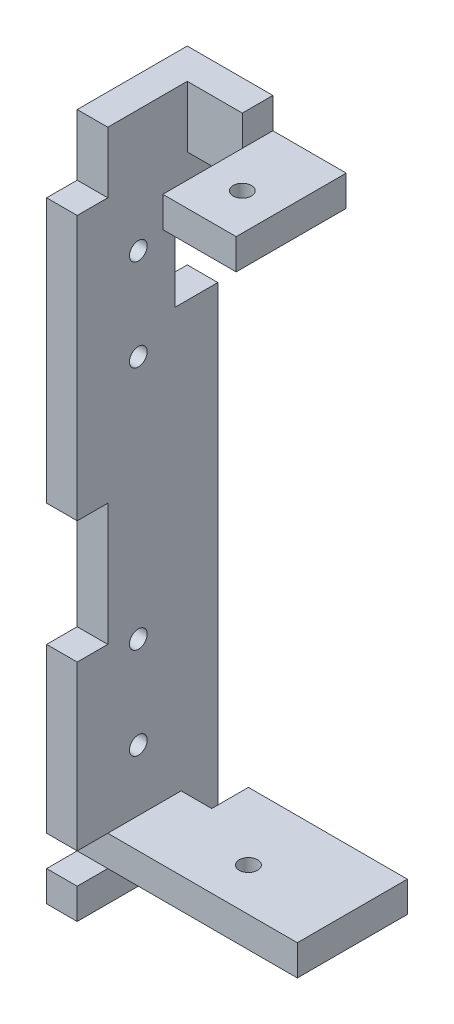
ISO-10303-21;
HEADER;
FILE_DESCRIPTION(('STEP AP214'),'2;1');
FILE_NAME('part.step','',(''),(''),'','','');
FILE_SCHEMA(('AUTOMOTIVE_DESIGN { 1 0 10303 214 1 1 1 1 }'));
ENDSEC;
DATA;
#1=APPLICATION_CONTEXT('core data for automotive mechanical design processes');
#2=APPLICATION_PROTOCOL_DEFINITION('international standard','automotive_design',2000,#1);
#3=PRODUCT_CONTEXT('',#1,'mechanical');
#4=PRODUCT('Part','Part','',(#3));
#5=PRODUCT_RELATED_PRODUCT_CATEGORY('part','',(#4));
#6=PRODUCT_DEFINITION_FORMATION('','',#4);
#7=PRODUCT_DEFINITION_CONTEXT('part definition',#1,'design');
#8=PRODUCT_DEFINITION('design','',#6,#7);
#9=PRODUCT_DEFINITION_SHAPE('','',#8);
#10=(LENGTH_UNIT() NAMED_UNIT(*) SI_UNIT(.MILLI.,.METRE.));
#11=(NAMED_UNIT(*) PLANE_ANGLE_UNIT() SI_UNIT($,.RADIAN.));
#12=(NAMED_UNIT(*) SI_UNIT($,.STERADIAN.) SOLID_ANGLE_UNIT());
#13=UNCERTAINTY_MEASURE_WITH_UNIT(LENGTH_MEASURE(1.E-05),#10,'distance_accuracy_value','');
#14=(GEOMETRIC_REPRESENTATION_CONTEXT(3) GLOBAL_UNCERTAINTY_ASSIGNED_CONTEXT((#13)) GLOBAL_UNIT_ASSIGNED_CONTEXT((#10,
#11,#12)) REPRESENTATION_CONTEXT('',''));
#15=CARTESIAN_POINT('',(0.,0.,0.));
#16=DIRECTION('',(0.,0.,1.));
#17=DIRECTION('',(1.,0.,0.));
#18=AXIS2_PLACEMENT_3D('',#15,#16,#17);
#19=CARTESIAN_POINT('',(0.,0.,18.));
#20=DIRECTION('',(0.,0.,-1.));
#21=DIRECTION('',(-1.,0.,0.));
#22=AXIS2_PLACEMENT_3D('',#19,#20,#21);
#23=PLANE('',#22);
#24=DIRECTION('',(-1.,0.,0.));
#25=VECTOR('',#24,1.);
#26=CARTESIAN_POINT('',(14.3930651789069,91.6076542783441,18.));
#27=LINE('',#26,#25);
#28=CARTESIAN_POINT('',(14.3930651789069,91.6076542783441,18.));
#29=VERTEX_POINT('',#28);
#30=CARTESIAN_POINT('',(2.39306517890692,91.6076542783441,18.));
#31=VERTEX_POINT('',#30);
#32=EDGE_CURVE('E303',#29,#31,#27,.T.);
#33=ORIENTED_EDGE('',*,*,#32,.T.);
#34=DIRECTION('',(0.,1.,0.));
#35=VECTOR('',#34,1.);
#36=CARTESIAN_POINT('',(2.39306517890692,96.6076542783441,18.));
#37=LINE('',#36,#35);
#38=CARTESIAN_POINT('',(2.39306517890692,86.607654278344,18.));
#39=VERTEX_POINT('',#38);
#40=EDGE_CURVE('E252',#39,#31,#37,.T.);
#41=ORIENTED_EDGE('',*,*,#40,.F.);
#42=DIRECTION('',(1.,0.,0.));
#43=VECTOR('',#42,1.);
#44=CARTESIAN_POINT('',(14.3930651789069,86.607654278344,18.));
#45=LINE('',#44,#43);
#46=CARTESIAN_POINT('',(14.3930651789069,86.607654278344,18.));
#47=VERTEX_POINT('',#46);
#48=EDGE_CURVE('E306',#39,#47,#45,.T.);
#49=ORIENTED_EDGE('',*,*,#48,.T.);
#50=DIRECTION('',(0.,1.,0.));
#51=VECTOR('',#50,1.);
#52=CARTESIAN_POINT('',(14.3930651789069,91.6076542783441,18.));
#53=LINE('',#52,#51);
#54=EDGE_CURVE('E301',#47,#29,#53,.T.);
#55=ORIENTED_EDGE('',*,*,#54,.T.);
#56=EDGE_LOOP('',(#33,#41,#49,#55));
#57=FACE_BOUND('',#56,.T.);
#58=ADVANCED_FACE('F32',(#57),#23,.F.);
#59=CARTESIAN_POINT('',(0.,0.,0.));
#60=DIRECTION('',(0.,0.,1.));
#61=DIRECTION('',(1.,0.,0.));
#62=AXIS2_PLACEMENT_3D('',#59,#60,#61);
#63=PLANE('',#62);
#64=DIRECTION('',(0.,1.,0.));
#65=VECTOR('',#64,1.);
#66=CARTESIAN_POINT('',(-6.60693482109309,91.6076542783441,0.));
#67=LINE('',#66,#65);
#68=CARTESIAN_POINT('',(-6.60693482109309,-13.3923457216559,0.));
#69=VERTEX_POINT('',#68);
#70=CARTESIAN_POINT('',(-6.60693482109309,65.6076542783441,0.));
#71=VERTEX_POINT('',#70);
#72=EDGE_CURVE('E424',#69,#71,#67,.T.);
#73=ORIENTED_EDGE('',*,*,#72,.F.);
#74=DIRECTION('',(1.,0.,0.));
#75=VECTOR('',#74,1.);
#76=CARTESIAN_POINT('',(-11.6069348210931,-13.3923457216559,0.));
#77=LINE('',#76,#75);
#78=CARTESIAN_POINT('',(-11.6069348210931,-13.3923457216559,0.));
#79=VERTEX_POINT('',#78);
#80=EDGE_CURVE('E412',#79,#69,#77,.T.);
#81=ORIENTED_EDGE('',*,*,#80,.F.);
#82=DIRECTION('',(0.,-1.,0.));
#83=VECTOR('',#82,1.);
#84=CARTESIAN_POINT('',(-11.6069348210931,91.6076542783441,0.));
#85=LINE('',#84,#83);
#86=CARTESIAN_POINT('',(-11.6069348210931,65.6076542783441,0.));
#87=VERTEX_POINT('',#86);
#88=EDGE_CURVE('E396',#87,#79,#85,.T.);
#89=ORIENTED_EDGE('',*,*,#88,.F.);
#90=DIRECTION('',(-1.,0.,0.));
#91=VECTOR('',#90,1.);
#92=CARTESIAN_POINT('',(24.3940651789069,65.6076542783441,0.));
#93=LINE('',#92,#91);
#94=EDGE_CURVE('E289',#71,#87,#93,.T.);
#95=ORIENTED_EDGE('',*,*,#94,.F.);
#96=EDGE_LOOP('',(#73,#81,#89,#95));
#97=FACE_BOUND('',#96,.T.);
#98=ADVANCED_FACE('F450',(#97),#63,.F.);
#99=CARTESIAN_POINT('',(-11.6069348210931,91.6076542783441,23.));
#100=DIRECTION('',(0.,-1.,0.));
#101=DIRECTION('',(0.,0.,-1.));
#102=AXIS2_PLACEMENT_3D('',#99,#100,#101);
#103=PLANE('',#102);
#104=CARTESIAN_POINT('',(8.39306517890691,91.6076542783441,11.));
#105=DIRECTION('',(0.,1.,0.));
#106=DIRECTION('',(0.,0.,1.));
#107=AXIS2_PLACEMENT_3D('',#104,#105,#106);
#108=CIRCLE('',#107,1.5);
#109=CARTESIAN_POINT('',(8.39306517890691,91.6076542783441,12.5));
#110=VERTEX_POINT('',#109);
#111=EDGE_CURVE('E482',#110,#110,#108,.T.);
#112=ORIENTED_EDGE('',*,*,#111,.F.);
#113=EDGE_LOOP('',(#112));
#114=FACE_BOUND('',#113,.T.);
#115=DIRECTION('',(0.,0.,-1.));
#116=VECTOR('',#115,1.);
#117=CARTESIAN_POINT('',(2.39306517890692,91.6076542783441,14.));
#118=LINE('',#117,#116);
#119=CARTESIAN_POINT('',(2.39306517890692,91.6076542783441,5.));
#120=VERTEX_POINT('',#119);
#121=EDGE_CURVE('E242',#31,#120,#118,.T.);
#122=ORIENTED_EDGE('',*,*,#121,.F.);
#123=ORIENTED_EDGE('',*,*,#32,.F.);
#124=DIRECTION('',(0.,0.,-1.));
#125=VECTOR('',#124,1.);
#126=CARTESIAN_POINT('',(14.3930651789069,91.6076542783441,49.4764045897475));
#127=LINE('',#126,#125);
#128=CARTESIAN_POINT('',(14.3930651789069,91.6076542783441,0.));
#129=VERTEX_POINT('',#128);
#130=EDGE_CURVE('E341',#29,#129,#127,.T.);
#131=ORIENTED_EDGE('',*,*,#130,.T.);
#132=DIRECTION('',(1.,0.,0.));
#133=VECTOR('',#132,1.);
#134=CARTESIAN_POINT('',(14.3930651789069,91.6076542783441,0.));
#135=LINE('',#134,#133);
#136=CARTESIAN_POINT('',(2.39306517890692,91.6076542783441,0.));
#137=VERTEX_POINT('',#136);
#138=EDGE_CURVE('E268',#137,#129,#135,.T.);
#139=ORIENTED_EDGE('',*,*,#138,.F.);
#140=DIRECTION('',(0.,0.,1.));
#141=VECTOR('',#140,1.);
#142=CARTESIAN_POINT('',(2.39306517890692,91.6076542783441,0.));
#143=LINE('',#142,#141);
#144=EDGE_CURVE('E271',#137,#120,#143,.T.);
#145=ORIENTED_EDGE('',*,*,#144,.T.);
#146=EDGE_LOOP('',(#122,#123,#131,#139,#145));
#147=FACE_BOUND('',#146,.T.);
#148=ADVANCED_FACE('F541',(#114,#147),#103,.F.);
#149=CARTESIAN_POINT('',(-6.60693482109309,78.6076542783441,0.));
#150=VERTEX_POINT('',#149);
#151=CARTESIAN_POINT('',(-6.60693482109309,86.607654278344,0.));
#152=VERTEX_POINT('',#151);
#153=EDGE_CURVE('E423',#150,#152,#67,.T.);
#154=ORIENTED_EDGE('',*,*,#153,.F.);
#155=DIRECTION('',(-1.,0.,0.));
#156=VECTOR('',#155,1.);
#157=CARTESIAN_POINT('',(24.3940651789069,78.6076542783441,0.));
#158=LINE('',#157,#156);
#159=CARTESIAN_POINT('',(-11.6069348210931,78.6076542783441,0.));
#160=VERTEX_POINT('',#159);
#161=EDGE_CURVE('E290',#150,#160,#158,.T.);
#162=ORIENTED_EDGE('',*,*,#161,.T.);
#163=CARTESIAN_POINT('',(-11.6069348210931,96.6076542783441,0.));
#164=VERTEX_POINT('',#163);
#165=EDGE_CURVE('E331',#164,#160,#85,.T.);
#166=ORIENTED_EDGE('',*,*,#165,.F.);
#167=DIRECTION('',(-1.,0.,0.));
#168=VECTOR('',#167,1.);
#169=CARTESIAN_POINT('',(-11.6069348210931,96.6076542783441,0.));
#170=LINE('',#169,#168);
#171=CARTESIAN_POINT('',(2.39306517890692,96.6076542783441,0.));
#172=VERTEX_POINT('',#171);
#173=EDGE_CURVE('E241',#172,#164,#170,.T.);
#174=ORIENTED_EDGE('',*,*,#173,.F.);
#175=DIRECTION('',(0.,-1.,0.));
#176=VECTOR('',#175,1.);
#177=CARTESIAN_POINT('',(2.39306517890692,86.607654278344,0.));
#178=LINE('',#177,#176);
#179=EDGE_CURVE('E251',#172,#137,#178,.T.);
#180=ORIENTED_EDGE('',*,*,#179,.T.);
#181=ORIENTED_EDGE('',*,*,#138,.T.);
#182=DIRECTION('',(0.,-1.,0.));
#183=VECTOR('',#182,1.);
#184=CARTESIAN_POINT('',(14.3930651789069,91.6076542783441,0.));
#185=LINE('',#184,#183);
#186=CARTESIAN_POINT('',(14.3930651789069,86.607654278344,0.));
#187=VERTEX_POINT('',#186);
#188=EDGE_CURVE('E259',#129,#187,#185,.T.);
#189=ORIENTED_EDGE('',*,*,#188,.T.);
#190=DIRECTION('',(-1.,0.,0.));
#191=VECTOR('',#190,1.);
#192=CARTESIAN_POINT('',(14.3930651789069,86.607654278344,0.));
#193=LINE('',#192,#191);
#194=EDGE_CURVE('E262',#187,#152,#193,.T.);
#195=ORIENTED_EDGE('',*,*,#194,.T.);
#196=EDGE_LOOP('',(#154,#162,#166,#174,#180,#181,#189,#195));
#197=FACE_BOUND('',#196,.T.);
#198=ADVANCED_FACE('F463',(#197),#63,.F.);
#199=CARTESIAN_POINT('',(0.,0.,23.));
#200=DIRECTION('',(0.,0.,1.));
#201=DIRECTION('',(1.,0.,0.));
#202=AXIS2_PLACEMENT_3D('',#199,#200,#201);
#203=PLANE('',#202);
#204=DIRECTION('',(1.,0.,0.));
#205=VECTOR('',#204,1.);
#206=CARTESIAN_POINT('',(24.3930651789069,-8.39234572165595,23.));
#207=LINE('',#206,#205);
#208=CARTESIAN_POINT('',(-11.6069348210931,-8.39234572165596,23.));
#209=VERTEX_POINT('',#208);
#210=CARTESIAN_POINT('',(-6.60693482109309,-8.39234572165596,23.));
#211=VERTEX_POINT('',#210);
#212=EDGE_CURVE('E349',#209,#211,#207,.T.);
#213=ORIENTED_EDGE('',*,*,#212,.F.);
#214=DIRECTION('',(0.,-1.,0.));
#215=VECTOR('',#214,1.);
#216=CARTESIAN_POINT('',(-11.6069348210931,91.6076542783441,23.));
#217=LINE('',#216,#215);
#218=CARTESIAN_POINT('',(-11.6069348210931,-13.3923457216559,23.));
#219=VERTEX_POINT('',#218);
#220=EDGE_CURVE('E401',#209,#219,#217,.T.);
#221=ORIENTED_EDGE('',*,*,#220,.T.);
#222=DIRECTION('',(1.,0.,0.));
#223=VECTOR('',#222,1.);
#224=CARTESIAN_POINT('',(-11.6069348210931,-13.3923457216559,23.));
#225=LINE('',#224,#223);
#226=CARTESIAN_POINT('',(-6.60693482109309,-13.3923457216559,23.));
#227=VERTEX_POINT('',#226);
#228=EDGE_CURVE('E399',#219,#227,#225,.T.);
#229=ORIENTED_EDGE('',*,*,#228,.T.);
#230=DIRECTION('',(0.,1.,0.));
#231=VECTOR('',#230,1.);
#232=CARTESIAN_POINT('',(-6.60693482109309,-8.39234572165595,23.));
#233=LINE('',#232,#231);
#234=EDGE_CURVE('E403',#227,#211,#233,.T.);
#235=ORIENTED_EDGE('',*,*,#234,.T.);
#236=EDGE_LOOP('',(#213,#221,#229,#235));
#237=FACE_BOUND('',#236,.T.);
#238=ADVANCED_FACE('F595',(#237),#203,.T.);
#239=CARTESIAN_POINT('',(-11.6069348210931,91.6076542783441,23.));
#240=DIRECTION('',(1.,0.,0.));
#241=DIRECTION('',(0.,1.,0.));
#242=AXIS2_PLACEMENT_3D('',#239,#240,#241);
#243=PLANE('',#242);
#244=CARTESIAN_POINT('',(-11.6069348210931,21.6076542783441,13.));
#245=DIRECTION('',(-1.,0.,0.));
#246=DIRECTION('',(0.,-1.,0.));
#247=AXIS2_PLACEMENT_3D('',#244,#245,#246);
#248=CIRCLE('',#247,1.45);
#249=CARTESIAN_POINT('',(-11.6069348210931,20.1576542783441,13.));
#250=VERTEX_POINT('',#249);
#251=EDGE_CURVE('E503',#250,#250,#248,.T.);
#252=ORIENTED_EDGE('',*,*,#251,.F.);
#253=EDGE_LOOP('',(#252));
#254=FACE_BOUND('',#253,.T.);
#255=CARTESIAN_POINT('',(-11.6069348210931,61.6076542783441,13.));
#256=DIRECTION('',(-1.,0.,0.));
#257=DIRECTION('',(0.,-1.,0.));
#258=AXIS2_PLACEMENT_3D('',#255,#256,#257);
#259=CIRCLE('',#258,1.45);
#260=CARTESIAN_POINT('',(-11.6069348210931,60.1576542783441,13.));
#261=VERTEX_POINT('',#260);
#262=EDGE_CURVE('E510',#261,#261,#259,.T.);
#263=ORIENTED_EDGE('',*,*,#262,.F.);
#264=EDGE_LOOP('',(#263));
#265=FACE_BOUND('',#264,.T.);
#266=CARTESIAN_POINT('',(-11.6069348210931,6.60765427834406,13.));
#267=DIRECTION('',(-1.,0.,0.));
#268=DIRECTION('',(0.,-1.,0.));
#269=AXIS2_PLACEMENT_3D('',#266,#267,#268);
#270=CIRCLE('',#269,1.45);
#271=CARTESIAN_POINT('',(-11.6069348210931,5.15765427834406,13.));
#272=VERTEX_POINT('',#271);
#273=EDGE_CURVE('E516',#272,#272,#270,.T.);
#274=ORIENTED_EDGE('',*,*,#273,.F.);
#275=EDGE_LOOP('',(#274));
#276=FACE_BOUND('',#275,.T.);
#277=CARTESIAN_POINT('',(-11.6069348210931,76.6076542783441,13.));
#278=DIRECTION('',(-1.,0.,0.));
#279=DIRECTION('',(0.,-1.,0.));
#280=AXIS2_PLACEMENT_3D('',#277,#278,#279);
#281=CIRCLE('',#280,1.45);
#282=CARTESIAN_POINT('',(-11.6069348210931,75.157654278344,13.));
#283=VERTEX_POINT('',#282);
#284=EDGE_CURVE('E316',#283,#283,#281,.T.);
#285=ORIENTED_EDGE('',*,*,#284,.F.);
#286=EDGE_LOOP('',(#285));
#287=FACE_BOUND('',#286,.T.);
#288=ORIENTED_EDGE('',*,*,#165,.T.);
#289=DIRECTION('',(0.,0.,-1.));
#290=VECTOR('',#289,1.);
#291=CARTESIAN_POINT('',(-11.6069348210931,78.6076542783441,0.));
#292=LINE('',#291,#290);
#293=CARTESIAN_POINT('',(-11.6069348210931,78.6076542783441,7.));
#294=VERTEX_POINT('',#293);
#295=EDGE_CURVE('E287',#294,#160,#292,.T.);
#296=ORIENTED_EDGE('',*,*,#295,.F.);
#297=DIRECTION('',(0.,1.,0.));
#298=VECTOR('',#297,1.);
#299=CARTESIAN_POINT('',(-11.6069348210931,78.6076542783441,7.));
#300=LINE('',#299,#298);
#301=CARTESIAN_POINT('',(-11.6069348210931,65.6076542783441,7.));
#302=VERTEX_POINT('',#301);
#303=EDGE_CURVE('E284',#302,#294,#300,.T.);
#304=ORIENTED_EDGE('',*,*,#303,.F.);
#305=DIRECTION('',(0.,0.,1.));
#306=VECTOR('',#305,1.);
#307=CARTESIAN_POINT('',(-11.6069348210931,65.6076542783441,0.));
#308=LINE('',#307,#306);
#309=EDGE_CURVE('E281',#87,#302,#308,.T.);
#310=ORIENTED_EDGE('',*,*,#309,.F.);
#311=ORIENTED_EDGE('',*,*,#88,.T.);
#312=DIRECTION('',(0.,0.,-1.));
#313=VECTOR('',#312,1.);
#314=CARTESIAN_POINT('',(-11.6069348210931,-13.3923457216559,23.));
#315=LINE('',#314,#313);
#316=EDGE_CURVE('E11',#219,#79,#315,.T.);
#317=ORIENTED_EDGE('',*,*,#316,.F.);
#318=ORIENTED_EDGE('',*,*,#220,.F.);
#319=DIRECTION('',(0.,0.,-1.));
#320=VECTOR('',#319,1.);
#321=CARTESIAN_POINT('',(-11.6069348210931,-8.39234572165595,23.));
#322=LINE('',#321,#320);
#323=CARTESIAN_POINT('',(-11.6069348210931,-8.39234572165596,18.));
#324=VERTEX_POINT('',#323);
#325=EDGE_CURVE('E364',#209,#324,#322,.T.);
#326=ORIENTED_EDGE('',*,*,#325,.T.);
#327=DIRECTION('',(0.,1.,0.));
#328=VECTOR('',#327,1.);
#329=CARTESIAN_POINT('',(-11.6069348210931,91.6076542783441,18.));
#330=LINE('',#329,#328);
#331=CARTESIAN_POINT('',(-11.6069348210931,-3.39234572165596,18.));
#332=VERTEX_POINT('',#331);
#333=EDGE_CURVE('E358',#324,#332,#330,.T.);
#334=ORIENTED_EDGE('',*,*,#333,.T.);
#335=DIRECTION('',(0.,0.,1.));
#336=VECTOR('',#335,1.);
#337=CARTESIAN_POINT('',(-11.6069348210931,-3.39234572165595,23.));
#338=LINE('',#337,#336);
#339=CARTESIAN_POINT('',(-11.6069348210931,-3.39234572165596,23.));
#340=VERTEX_POINT('',#339);
#341=EDGE_CURVE('E361',#332,#340,#338,.T.);
#342=ORIENTED_EDGE('',*,*,#341,.T.);
#343=CARTESIAN_POINT('',(-11.6069348210931,23.3576542783441,23.));
#344=VERTEX_POINT('',#343);
#345=EDGE_CURVE('E400',#344,#340,#217,.T.);
#346=ORIENTED_EDGE('',*,*,#345,.F.);
#347=DIRECTION('',(0.,0.,1.));
#348=VECTOR('',#347,1.);
#349=CARTESIAN_POINT('',(-11.6069348210931,23.3576542783441,18.));
#350=LINE('',#349,#348);
#351=CARTESIAN_POINT('',(-11.6069348210931,23.3576542783441,18.));
#352=VERTEX_POINT('',#351);
#353=EDGE_CURVE('E391',#352,#344,#350,.T.);
#354=ORIENTED_EDGE('',*,*,#353,.F.);
#355=DIRECTION('',(0.,1.,0.));
#356=VECTOR('',#355,1.);
#357=CARTESIAN_POINT('',(-11.6069348210931,23.3576542783441,18.));
#358=LINE('',#357,#356);
#359=CARTESIAN_POINT('',(-11.6069348210931,43.3576542783441,18.));
#360=VERTEX_POINT('',#359);
#361=EDGE_CURVE('E376',#352,#360,#358,.T.);
#362=ORIENTED_EDGE('',*,*,#361,.T.);
#363=DIRECTION('',(0.,0.,1.));
#364=VECTOR('',#363,1.);
#365=CARTESIAN_POINT('',(-11.6069348210931,43.3576542783441,18.));
#366=LINE('',#365,#364);
#367=CARTESIAN_POINT('',(-11.6069348210931,43.3576542783441,23.));
#368=VERTEX_POINT('',#367);
#369=EDGE_CURVE('E388',#360,#368,#366,.T.);
#370=ORIENTED_EDGE('',*,*,#369,.T.);
#371=CARTESIAN_POINT('',(-11.6069348210931,86.607654278344,23.));
#372=VERTEX_POINT('',#371);
#373=EDGE_CURVE('E397',#372,#368,#217,.T.);
#374=ORIENTED_EDGE('',*,*,#373,.F.);
#375=DIRECTION('',(0.,0.,-1.));
#376=VECTOR('',#375,1.);
#377=CARTESIAN_POINT('',(-11.6069348210931,86.607654278344,23.));
#378=LINE('',#377,#376);
#379=CARTESIAN_POINT('',(-11.6069348210931,86.607654278344,18.));
#380=VERTEX_POINT('',#379);
#381=EDGE_CURVE('E335',#372,#380,#378,.T.);
#382=ORIENTED_EDGE('',*,*,#381,.T.);
#383=DIRECTION('',(0.,1.,0.));
#384=VECTOR('',#383,1.);
#385=CARTESIAN_POINT('',(-11.6069348210931,91.6076542783441,18.));
#386=LINE('',#385,#384);
#387=CARTESIAN_POINT('',(-11.6069348210931,96.6076542783441,18.));
#388=VERTEX_POINT('',#387);
#389=EDGE_CURVE('E333',#380,#388,#386,.T.);
#390=ORIENTED_EDGE('',*,*,#389,.T.);
#391=DIRECTION('',(0.,0.,1.));
#392=VECTOR('',#391,1.);
#393=CARTESIAN_POINT('',(-11.6069348210931,96.6076542783441,5.));
#394=LINE('',#393,#392);
#395=EDGE_CURVE('E258',#164,#388,#394,.T.);
#396=ORIENTED_EDGE('',*,*,#395,.F.);
#397=EDGE_LOOP('',(#288,#296,#304,#310,#311,#317,#318,#326,#334,#342,#346,#354,#362,#370,#374,
#382,#390,#396));
#398=FACE_BOUND('',#397,.T.);
#399=ADVANCED_FACE('F34',(#254,#265,#276,#287,#398),#243,.F.);
#400=DIRECTION('',(-1.,0.,0.));
#401=VECTOR('',#400,1.);
#402=CARTESIAN_POINT('',(24.3930651789069,-3.39234572165595,23.));
#403=LINE('',#402,#401);
#404=CARTESIAN_POINT('',(-6.60693482109308,-3.39234572165596,23.));
#405=VERTEX_POINT('',#404);
#406=EDGE_CURVE('E344',#405,#340,#403,.T.);
#407=ORIENTED_EDGE('',*,*,#406,.F.);
#408=DIRECTION('',(0.,1.,0.));
#409=VECTOR('',#408,1.);
#410=CARTESIAN_POINT('',(-6.60693482109309,81.2169362732362,23.));
#411=LINE('',#410,#409);
#412=CARTESIAN_POINT('',(-6.60693482109308,23.3576542783441,23.));
#413=VERTEX_POINT('',#412);
#414=EDGE_CURVE('E407',#405,#413,#411,.T.);
#415=ORIENTED_EDGE('',*,*,#414,.T.);
#416=DIRECTION('',(-1.,0.,0.));
#417=VECTOR('',#416,1.);
#418=CARTESIAN_POINT('',(-6.60693482109308,23.3576542783441,23.));
#419=LINE('',#418,#417);
#420=EDGE_CURVE('E382',#413,#344,#419,.T.);
#421=ORIENTED_EDGE('',*,*,#420,.T.);
#422=ORIENTED_EDGE('',*,*,#345,.T.);
#423=EDGE_LOOP('',(#407,#415,#421,#422));
#424=FACE_BOUND('',#423,.T.);
#425=ADVANCED_FACE('F592',(#424),#203,.T.);
#426=DIRECTION('',(1.,0.,0.));
#427=VECTOR('',#426,1.);
#428=CARTESIAN_POINT('',(14.3930651789069,86.607654278344,23.));
#429=LINE('',#428,#427);
#430=CARTESIAN_POINT('',(-6.60693482109309,86.607654278344,23.));
#431=VERTEX_POINT('',#430);
#432=EDGE_CURVE('E300',#372,#431,#429,.T.);
#433=ORIENTED_EDGE('',*,*,#432,.F.);
#434=ORIENTED_EDGE('',*,*,#373,.T.);
#435=DIRECTION('',(1.,0.,0.));
#436=VECTOR('',#435,1.);
#437=CARTESIAN_POINT('',(-6.60693482109308,43.3576542783441,23.));
#438=LINE('',#437,#436);
#439=CARTESIAN_POINT('',(-6.60693482109309,43.3576542783441,23.));
#440=VERTEX_POINT('',#439);
#441=EDGE_CURVE('E374',#368,#440,#438,.T.);
#442=ORIENTED_EDGE('',*,*,#441,.T.);
#443=EDGE_CURVE('E406',#440,#431,#411,.T.);
#444=ORIENTED_EDGE('',*,*,#443,.T.);
#445=EDGE_LOOP('',(#433,#434,#442,#444));
#446=FACE_BOUND('',#445,.T.);
#447=ADVANCED_FACE('F534',(#446),#203,.T.);
#448=CARTESIAN_POINT('',(-11.6069348210931,-13.3923457216559,23.));
#449=DIRECTION('',(0.,1.,0.));
#450=DIRECTION('',(0.,0.,1.));
#451=AXIS2_PLACEMENT_3D('',#448,#449,#450);
#452=PLANE('',#451);
#453=ORIENTED_EDGE('',*,*,#80,.T.);
#454=DIRECTION('',(0.,0.,-1.));
#455=VECTOR('',#454,1.);
#456=CARTESIAN_POINT('',(-6.60693482109309,-13.3923457216559,23.));
#457=LINE('',#456,#455);
#458=EDGE_CURVE('E41',#227,#69,#457,.T.);
#459=ORIENTED_EDGE('',*,*,#458,.F.);
#460=ORIENTED_EDGE('',*,*,#228,.F.);
#461=ORIENTED_EDGE('',*,*,#316,.T.);
#462=EDGE_LOOP('',(#453,#459,#460,#461));
#463=FACE_BOUND('',#462,.T.);
#464=ADVANCED_FACE('F445',(#463),#452,.F.);
#465=CARTESIAN_POINT('',(-6.60693482109309,-8.39234572165595,23.));
#466=DIRECTION('',(-1.,0.,0.));
#467=DIRECTION('',(0.,-1.,0.));
#468=AXIS2_PLACEMENT_3D('',#465,#466,#467);
#469=PLANE('',#468);
#470=DIRECTION('',(0.,0.,-1.));
#471=VECTOR('',#470,1.);
#472=CARTESIAN_POINT('',(-6.60693482109309,96.6076542783441,14.));
#473=LINE('',#472,#471);
#474=CARTESIAN_POINT('',(-6.60693482109309,96.6076542783441,18.));
#475=VERTEX_POINT('',#474);
#476=CARTESIAN_POINT('',(-6.60693482109309,96.6076542783441,5.));
#477=VERTEX_POINT('',#476);
#478=EDGE_CURVE('E228',#475,#477,#473,.T.);
#479=ORIENTED_EDGE('',*,*,#478,.F.);
#480=DIRECTION('',(0.,-1.,0.));
#481=VECTOR('',#480,1.);
#482=CARTESIAN_POINT('',(-6.60693482109309,96.6076542783441,18.));
#483=LINE('',#482,#481);
#484=CARTESIAN_POINT('',(-6.60693482109309,86.607654278344,18.));
#485=VERTEX_POINT('',#484);
#486=EDGE_CURVE('E233',#475,#485,#483,.T.);
#487=ORIENTED_EDGE('',*,*,#486,.T.);
#488=DIRECTION('',(0.,0.,1.));
#489=VECTOR('',#488,1.);
#490=CARTESIAN_POINT('',(-6.60693482109309,86.607654278344,23.));
#491=LINE('',#490,#489);
#492=EDGE_CURVE('E336',#485,#431,#491,.T.);
#493=ORIENTED_EDGE('',*,*,#492,.T.);
#494=ORIENTED_EDGE('',*,*,#443,.F.);
#495=DIRECTION('',(0.,0.,1.));
#496=VECTOR('',#495,1.);
#497=CARTESIAN_POINT('',(-6.60693482109308,43.3576542783441,18.));
#498=LINE('',#497,#496);
#499=CARTESIAN_POINT('',(-6.60693482109308,43.3576542783441,18.));
#500=VERTEX_POINT('',#499);
#501=EDGE_CURVE('E381',#500,#440,#498,.T.);
#502=ORIENTED_EDGE('',*,*,#501,.F.);
#503=DIRECTION('',(0.,-1.,0.));
#504=VECTOR('',#503,1.);
#505=CARTESIAN_POINT('',(-6.60693482109308,23.3576542783441,18.));
#506=LINE('',#505,#504);
#507=CARTESIAN_POINT('',(-6.60693482109308,23.3576542783441,18.));
#508=VERTEX_POINT('',#507);
#509=EDGE_CURVE('E370',#500,#508,#506,.T.);
#510=ORIENTED_EDGE('',*,*,#509,.T.);
#511=DIRECTION('',(0.,0.,1.));
#512=VECTOR('',#511,1.);
#513=CARTESIAN_POINT('',(-6.60693482109308,23.3576542783441,18.));
#514=LINE('',#513,#512);
#515=EDGE_CURVE('E393',#508,#413,#514,.T.);
#516=ORIENTED_EDGE('',*,*,#515,.T.);
#517=ORIENTED_EDGE('',*,*,#414,.F.);
#518=DIRECTION('',(0.,0.,-1.));
#519=VECTOR('',#518,1.);
#520=CARTESIAN_POINT('',(-6.60693482109308,-3.39234572165595,23.));
#521=LINE('',#520,#519);
#522=CARTESIAN_POINT('',(-6.60693482109308,-3.39234572165596,18.));
#523=VERTEX_POINT('',#522);
#524=EDGE_CURVE('E427',#405,#523,#521,.T.);
#525=ORIENTED_EDGE('',*,*,#524,.T.);
#526=CARTESIAN_POINT('',(-6.60693482109309,-3.39234572165595,6.));
#527=VERTEX_POINT('',#526);
#528=EDGE_CURVE('E410',#523,#527,#521,.T.);
#529=ORIENTED_EDGE('',*,*,#528,.T.);
#530=DIRECTION('',(0.,1.,0.));
#531=VECTOR('',#530,1.);
#532=CARTESIAN_POINT('',(-6.60693482109309,-8.39234572165595,6.));
#533=LINE('',#532,#531);
#534=CARTESIAN_POINT('',(-6.60693482109309,-8.39234572165595,6.));
#535=VERTEX_POINT('',#534);
#536=EDGE_CURVE('E488',#535,#527,#533,.T.);
#537=ORIENTED_EDGE('',*,*,#536,.F.);
#538=DIRECTION('',(0.,0.,-1.));
#539=VECTOR('',#538,1.);
#540=CARTESIAN_POINT('',(-6.60693482109309,-8.39234572165595,23.));
#541=LINE('',#540,#539);
#542=CARTESIAN_POINT('',(-6.60693482109309,-8.39234572165596,18.));
#543=VERTEX_POINT('',#542);
#544=EDGE_CURVE('E435',#543,#535,#541,.T.);
#545=ORIENTED_EDGE('',*,*,#544,.F.);
#546=EDGE_CURVE('E436',#211,#543,#541,.T.);
#547=ORIENTED_EDGE('',*,*,#546,.F.);
#548=ORIENTED_EDGE('',*,*,#234,.F.);
#549=ORIENTED_EDGE('',*,*,#458,.T.);
#550=ORIENTED_EDGE('',*,*,#72,.T.);
#551=DIRECTION('',(0.,0.,-1.));
#552=VECTOR('',#551,1.);
#553=CARTESIAN_POINT('',(-6.60693482109309,65.6076542783441,0.));
#554=LINE('',#553,#552);
#555=CARTESIAN_POINT('',(-6.60693482109309,65.6076542783441,7.));
#556=VERTEX_POINT('',#555);
#557=EDGE_CURVE('E293',#556,#71,#554,.T.);
#558=ORIENTED_EDGE('',*,*,#557,.F.);
#559=DIRECTION('',(0.,-1.,0.));
#560=VECTOR('',#559,1.);
#561=CARTESIAN_POINT('',(-6.60693482109309,78.6076542783441,7.));
#562=LINE('',#561,#560);
#563=CARTESIAN_POINT('',(-6.60693482109309,78.6076542783441,7.));
#564=VERTEX_POINT('',#563);
#565=EDGE_CURVE('E275',#564,#556,#562,.T.);
#566=ORIENTED_EDGE('',*,*,#565,.F.);
#567=DIRECTION('',(0.,0.,1.));
#568=VECTOR('',#567,1.);
#569=CARTESIAN_POINT('',(-6.60693482109309,78.6076542783441,0.));
#570=LINE('',#569,#568);
#571=EDGE_CURVE('E278',#150,#564,#570,.T.);
#572=ORIENTED_EDGE('',*,*,#571,.F.);
#573=ORIENTED_EDGE('',*,*,#153,.T.);
#574=DIRECTION('',(0.,0.,-1.));
#575=VECTOR('',#574,1.);
#576=CARTESIAN_POINT('',(-6.60693482109309,86.607654278344,5.));
#577=LINE('',#576,#575);
#578=CARTESIAN_POINT('',(-6.60693482109309,86.607654278344,5.));
#579=VERTEX_POINT('',#578);
#580=EDGE_CURVE('E470',#579,#152,#577,.T.);
#581=ORIENTED_EDGE('',*,*,#580,.F.);
#582=DIRECTION('',(0.,1.,0.));
#583=VECTOR('',#582,1.);
#584=CARTESIAN_POINT('',(-6.60693482109309,86.607654278344,5.));
#585=LINE('',#584,#583);
#586=EDGE_CURVE('E236',#579,#477,#585,.T.);
#587=ORIENTED_EDGE('',*,*,#586,.T.);
#588=EDGE_LOOP('',(#479,#487,#493,#494,#502,#510,#516,#517,#525,#529,#537,#545,#547,#548,#549,
#550,#558,#566,#572,#573,#581,#587));
#589=FACE_BOUND('',#588,.T.);
#590=CARTESIAN_POINT('',(-6.60693482109309,21.6076542783441,13.));
#591=DIRECTION('',(-1.,0.,0.));
#592=DIRECTION('',(0.,0.,1.));
#593=AXIS2_PLACEMENT_3D('',#590,#591,#592);
#594=CIRCLE('',#593,1.45);
#595=CARTESIAN_POINT('',(-6.60693482109309,21.6076542783441,14.45));
#596=VERTEX_POINT('',#595);
#597=EDGE_CURVE('E507',#596,#596,#594,.F.);
#598=ORIENTED_EDGE('',*,*,#597,.F.);
#599=EDGE_LOOP('',(#598));
#600=FACE_BOUND('',#599,.T.);
#601=CARTESIAN_POINT('',(-6.60693482109309,61.6076542783441,13.));
#602=DIRECTION('',(-1.,0.,0.));
#603=DIRECTION('',(0.,0.,1.));
#604=AXIS2_PLACEMENT_3D('',#601,#602,#603);
#605=CIRCLE('',#604,1.45);
#606=CARTESIAN_POINT('',(-6.60693482109309,61.6076542783441,14.45));
#607=VERTEX_POINT('',#606);
#608=EDGE_CURVE('E513',#607,#607,#605,.F.);
#609=ORIENTED_EDGE('',*,*,#608,.F.);
#610=EDGE_LOOP('',(#609));
#611=FACE_BOUND('',#610,.T.);
#612=CARTESIAN_POINT('',(-6.60693482109309,6.60765427834406,13.));
#613=DIRECTION('',(-1.,0.,0.));
#614=DIRECTION('',(0.,0.,1.));
#615=AXIS2_PLACEMENT_3D('',#612,#613,#614);
#616=CIRCLE('',#615,1.45);
#617=CARTESIAN_POINT('',(-6.60693482109309,6.60765427834406,14.45));
#618=VERTEX_POINT('',#617);
#619=EDGE_CURVE('E321',#618,#618,#616,.F.);
#620=ORIENTED_EDGE('',*,*,#619,.F.);
#621=EDGE_LOOP('',(#620));
#622=FACE_BOUND('',#621,.T.);
#623=CARTESIAN_POINT('',(-6.60693482109309,76.6076542783441,13.));
#624=DIRECTION('',(-1.,0.,0.));
#625=DIRECTION('',(0.,0.,1.));
#626=AXIS2_PLACEMENT_3D('',#623,#624,#625);
#627=CIRCLE('',#626,1.45);
#628=CARTESIAN_POINT('',(-6.60693482109309,76.6076542783441,14.45));
#629=VERTEX_POINT('',#628);
#630=EDGE_CURVE('E312',#629,#629,#627,.F.);
#631=ORIENTED_EDGE('',*,*,#630,.F.);
#632=EDGE_LOOP('',(#631));
#633=FACE_BOUND('',#632,.T.);
#634=ADVANCED_FACE('F230',(#589,#600,#611,#622,#633),#469,.F.);
#635=CARTESIAN_POINT('',(-6.60693482109309,-8.39234572165595,23.));
#636=DIRECTION('',(0.,1.,0.));
#637=DIRECTION('',(-1.,0.,0.));
#638=AXIS2_PLACEMENT_3D('',#635,#636,#637);
#639=PLANE('',#638);
#640=CARTESIAN_POINT('',(9.39306517890692,-8.39234572165595,11.));
#641=DIRECTION('',(0.,-1.,0.));
#642=DIRECTION('',(1.,0.,0.));
#643=AXIS2_PLACEMENT_3D('',#640,#641,#642);
#644=CIRCLE('',#643,1.5);
#645=CARTESIAN_POINT('',(10.8930651789069,-8.39234572165595,11.));
#646=VERTEX_POINT('',#645);
#647=EDGE_CURVE('E367',#646,#646,#644,.T.);
#648=ORIENTED_EDGE('',*,*,#647,.F.);
#649=EDGE_LOOP('',(#648));
#650=FACE_BOUND('',#649,.T.);
#651=DIRECTION('',(-1.,0.,0.));
#652=VECTOR('',#651,1.);
#653=CARTESIAN_POINT('',(-6.60693482109309,-8.39234572165595,6.));
#654=LINE('',#653,#652);
#655=CARTESIAN_POINT('',(-1.60693482109309,-8.39234572165595,6.));
#656=VERTEX_POINT('',#655);
#657=EDGE_CURVE('E496',#656,#535,#654,.T.);
#658=ORIENTED_EDGE('',*,*,#657,.F.);
#659=DIRECTION('',(0.,0.,-1.));
#660=VECTOR('',#659,1.);
#661=CARTESIAN_POINT('',(-1.60693482109309,-8.39234572165595,6.));
#662=LINE('',#661,#660);
#663=CARTESIAN_POINT('',(-1.60693482109309,-8.39234572165595,0.));
#664=VERTEX_POINT('',#663);
#665=EDGE_CURVE('E500',#656,#664,#662,.T.);
#666=ORIENTED_EDGE('',*,*,#665,.T.);
#667=DIRECTION('',(1.,0.,0.));
#668=VECTOR('',#667,1.);
#669=CARTESIAN_POINT('',(-6.60693482109309,-8.39234572165595,0.));
#670=LINE('',#669,#668);
#671=CARTESIAN_POINT('',(24.3930651789069,-8.39234572165595,0.));
#672=VERTEX_POINT('',#671);
#673=EDGE_CURVE('E415',#664,#672,#670,.T.);
#674=ORIENTED_EDGE('',*,*,#673,.T.);
#675=DIRECTION('',(0.,0.,-1.));
#676=VECTOR('',#675,1.);
#677=CARTESIAN_POINT('',(24.3930651789069,-8.39234572165595,23.));
#678=LINE('',#677,#676);
#679=CARTESIAN_POINT('',(24.3930651789069,-8.39234572165595,18.));
#680=VERTEX_POINT('',#679);
#681=EDGE_CURVE('E432',#680,#672,#678,.T.);
#682=ORIENTED_EDGE('',*,*,#681,.F.);
#683=DIRECTION('',(1.,0.,0.));
#684=VECTOR('',#683,1.);
#685=CARTESIAN_POINT('',(24.3930651789069,-8.39234572165595,18.));
#686=LINE('',#685,#684);
#687=EDGE_CURVE('E353',#543,#680,#686,.T.);
#688=ORIENTED_EDGE('',*,*,#687,.F.);
#689=ORIENTED_EDGE('',*,*,#544,.T.);
#690=EDGE_LOOP('',(#658,#666,#674,#682,#688,#689));
#691=FACE_BOUND('',#690,.T.);
#692=ADVANCED_FACE('F525',(#650,#691),#639,.F.);
#693=CARTESIAN_POINT('',(24.3930651789069,-8.39234572165595,23.));
#694=DIRECTION('',(-1.,0.,0.));
#695=DIRECTION('',(0.,-1.,0.));
#696=AXIS2_PLACEMENT_3D('',#693,#694,#695);
#697=PLANE('',#696);
#698=DIRECTION('',(0.,0.,-1.));
#699=VECTOR('',#698,1.);
#700=CARTESIAN_POINT('',(24.3930651789069,-3.39234572165595,23.));
#701=LINE('',#700,#699);
#702=CARTESIAN_POINT('',(24.3930651789069,-3.39234572165595,18.));
#703=VERTEX_POINT('',#702);
#704=CARTESIAN_POINT('',(24.3930651789069,-3.39234572165595,0.));
#705=VERTEX_POINT('',#704);
#706=EDGE_CURVE('E430',#703,#705,#701,.T.);
#707=ORIENTED_EDGE('',*,*,#706,.F.);
#708=DIRECTION('',(0.,1.,0.));
#709=VECTOR('',#708,1.);
#710=CARTESIAN_POINT('',(24.3930651789069,-3.39234572165595,18.));
#711=LINE('',#710,#709);
#712=EDGE_CURVE('E346',#680,#703,#711,.T.);
#713=ORIENTED_EDGE('',*,*,#712,.F.);
#714=ORIENTED_EDGE('',*,*,#681,.T.);
#715=DIRECTION('',(0.,1.,0.));
#716=VECTOR('',#715,1.);
#717=CARTESIAN_POINT('',(24.3930651789069,-8.39234572165595,0.));
#718=LINE('',#717,#716);
#719=EDGE_CURVE('E417',#672,#705,#718,.T.);
#720=ORIENTED_EDGE('',*,*,#719,.T.);
#721=EDGE_LOOP('',(#707,#713,#714,#720));
#722=FACE_BOUND('',#721,.T.);
#723=ADVANCED_FACE('F531',(#722),#697,.F.);
#724=CARTESIAN_POINT('',(-6.60693482109308,-3.39234572165595,23.));
#725=DIRECTION('',(0.,-1.,0.));
#726=DIRECTION('',(0.,0.,-1.));
#727=AXIS2_PLACEMENT_3D('',#724,#725,#726);
#728=PLANE('',#727);
#729=CARTESIAN_POINT('',(9.39306517890692,-3.39234572165595,11.));
#730=DIRECTION('',(0.,-1.,0.));
#731=DIRECTION('',(0.,0.,-1.));
#732=AXIS2_PLACEMENT_3D('',#729,#730,#731);
#733=CIRCLE('',#732,1.5);
#734=CARTESIAN_POINT('',(9.39306517890692,-3.39234572165595,9.5));
#735=VERTEX_POINT('',#734);
#736=EDGE_CURVE('E311',#735,#735,#733,.T.);
#737=ORIENTED_EDGE('',*,*,#736,.T.);
#738=EDGE_LOOP('',(#737));
#739=FACE_BOUND('',#738,.T.);
#740=DIRECTION('',(-1.,0.,0.));
#741=VECTOR('',#740,1.);
#742=CARTESIAN_POINT('',(-6.60693482109308,-3.39234572165595,0.));
#743=LINE('',#742,#741);
#744=CARTESIAN_POINT('',(-1.60693482109309,-3.39234572165595,0.));
#745=VERTEX_POINT('',#744);
#746=EDGE_CURVE('E420',#705,#745,#743,.T.);
#747=ORIENTED_EDGE('',*,*,#746,.T.);
#748=DIRECTION('',(0.,0.,-1.));
#749=VECTOR('',#748,1.);
#750=CARTESIAN_POINT('',(-1.60693482109309,-3.39234572165595,6.));
#751=LINE('',#750,#749);
#752=CARTESIAN_POINT('',(-1.60693482109309,-3.39234572165595,6.));
#753=VERTEX_POINT('',#752);
#754=EDGE_CURVE('E57',#753,#745,#751,.T.);
#755=ORIENTED_EDGE('',*,*,#754,.F.);
#756=DIRECTION('',(1.,0.,0.));
#757=VECTOR('',#756,1.);
#758=CARTESIAN_POINT('',(-6.60693482109309,-3.39234572165595,6.));
#759=LINE('',#758,#757);
#760=EDGE_CURVE('E490',#527,#753,#759,.T.);
#761=ORIENTED_EDGE('',*,*,#760,.F.);
#762=ORIENTED_EDGE('',*,*,#528,.F.);
#763=DIRECTION('',(-1.,0.,0.));
#764=VECTOR('',#763,1.);
#765=CARTESIAN_POINT('',(24.3930651789069,-3.39234572165595,18.));
#766=LINE('',#765,#764);
#767=EDGE_CURVE('E350',#703,#523,#766,.T.);
#768=ORIENTED_EDGE('',*,*,#767,.F.);
#769=ORIENTED_EDGE('',*,*,#706,.T.);
#770=EDGE_LOOP('',(#747,#755,#761,#762,#768,#769));
#771=FACE_BOUND('',#770,.T.);
#772=ADVANCED_FACE('F598',(#739,#771),#728,.F.);
#773=ORIENTED_EDGE('',*,*,#673,.F.);
#774=DIRECTION('',(0.,-1.,0.));
#775=VECTOR('',#774,1.);
#776=CARTESIAN_POINT('',(-1.60693482109309,-8.39234572165595,0.));
#777=LINE('',#776,#775);
#778=EDGE_CURVE('E485',#745,#664,#777,.T.);
#779=ORIENTED_EDGE('',*,*,#778,.F.);
#780=ORIENTED_EDGE('',*,*,#746,.F.);
#781=ORIENTED_EDGE('',*,*,#719,.F.);
#782=EDGE_LOOP('',(#773,#779,#780,#781));
#783=FACE_BOUND('',#782,.T.);
#784=ADVANCED_FACE('F543',(#783),#63,.F.);
#785=CARTESIAN_POINT('',(-6.60693482109308,23.3576542783441,18.));
#786=DIRECTION('',(0.,1.,0.));
#787=DIRECTION('',(0.,0.,1.));
#788=AXIS2_PLACEMENT_3D('',#785,#786,#787);
#789=PLANE('',#788);
#790=ORIENTED_EDGE('',*,*,#420,.F.);
#791=ORIENTED_EDGE('',*,*,#515,.F.);
#792=DIRECTION('',(-1.,0.,0.));
#793=VECTOR('',#792,1.);
#794=CARTESIAN_POINT('',(-6.60693482109308,23.3576542783441,18.));
#795=LINE('',#794,#793);
#796=EDGE_CURVE('E373',#508,#352,#795,.T.);
#797=ORIENTED_EDGE('',*,*,#796,.T.);
#798=ORIENTED_EDGE('',*,*,#353,.T.);
#799=EDGE_LOOP('',(#790,#791,#797,#798));
#800=FACE_BOUND('',#799,.T.);
#801=ADVANCED_FACE('F587',(#800),#789,.T.);
#802=CARTESIAN_POINT('',(-6.60693482109308,43.3576542783441,18.));
#803=DIRECTION('',(0.,-1.,0.));
#804=DIRECTION('',(0.,0.,-1.));
#805=AXIS2_PLACEMENT_3D('',#802,#803,#804);
#806=PLANE('',#805);
#807=ORIENTED_EDGE('',*,*,#441,.F.);
#808=ORIENTED_EDGE('',*,*,#369,.F.);
#809=DIRECTION('',(1.,0.,0.));
#810=VECTOR('',#809,1.);
#811=CARTESIAN_POINT('',(-6.60693482109308,43.3576542783441,18.));
#812=LINE('',#811,#810);
#813=EDGE_CURVE('E379',#360,#500,#812,.T.);
#814=ORIENTED_EDGE('',*,*,#813,.T.);
#815=ORIENTED_EDGE('',*,*,#501,.T.);
#816=EDGE_LOOP('',(#807,#808,#814,#815));
#817=FACE_BOUND('',#816,.T.);
#818=ADVANCED_FACE('F583',(#817),#806,.T.);
#819=CARTESIAN_POINT('',(0.,0.,18.));
#820=DIRECTION('',(0.,0.,1.));
#821=DIRECTION('',(1.,0.,0.));
#822=AXIS2_PLACEMENT_3D('',#819,#820,#821);
#823=PLANE('',#822);
#824=ORIENTED_EDGE('',*,*,#509,.F.);
#825=ORIENTED_EDGE('',*,*,#813,.F.);
#826=ORIENTED_EDGE('',*,*,#361,.F.);
#827=ORIENTED_EDGE('',*,*,#796,.F.);
#828=EDGE_LOOP('',(#824,#825,#826,#827));
#829=FACE_BOUND('',#828,.T.);
#830=ADVANCED_FACE('F579',(#829),#823,.T.);
#831=CARTESIAN_POINT('',(9.39306517890693,91.6076542783441,11.));
#832=DIRECTION('',(0.,-1.,0.));
#833=DIRECTION('',(1.,0.,0.));
#834=AXIS2_PLACEMENT_3D('',#831,#832,#833);
#835=CYLINDRICAL_SURFACE('',#834,1.5);
#836=ORIENTED_EDGE('',*,*,#647,.T.);
#837=EDGE_LOOP('',(#836));
#838=FACE_BOUND('',#837,.T.);
#839=ORIENTED_EDGE('',*,*,#736,.F.);
#840=EDGE_LOOP('',(#839));
#841=FACE_BOUND('',#840,.T.);
#842=ADVANCED_FACE('F572',(#838,#841),#835,.F.);
#843=CARTESIAN_POINT('',(24.3930651789069,-8.39234572165595,18.));
#844=DIRECTION('',(0.,-1.,0.));
#845=DIRECTION('',(1.,0.,0.));
#846=AXIS2_PLACEMENT_3D('',#843,#844,#845);
#847=PLANE('',#846);
#848=ORIENTED_EDGE('',*,*,#212,.T.);
#849=ORIENTED_EDGE('',*,*,#546,.T.);
#850=EDGE_CURVE('E355',#324,#543,#686,.T.);
#851=ORIENTED_EDGE('',*,*,#850,.F.);
#852=ORIENTED_EDGE('',*,*,#325,.F.);
#853=EDGE_LOOP('',(#848,#849,#851,#852));
#854=FACE_BOUND('',#853,.T.);
#855=ADVANCED_FACE('F569',(#854),#847,.F.);
#856=CARTESIAN_POINT('',(24.3930651789069,-3.39234572165595,18.));
#857=DIRECTION('',(0.,1.,0.));
#858=DIRECTION('',(-1.,0.,0.));
#859=AXIS2_PLACEMENT_3D('',#856,#857,#858);
#860=PLANE('',#859);
#861=EDGE_CURVE('E348',#523,#332,#766,.T.);
#862=ORIENTED_EDGE('',*,*,#861,.F.);
#863=ORIENTED_EDGE('',*,*,#524,.F.);
#864=ORIENTED_EDGE('',*,*,#406,.T.);
#865=ORIENTED_EDGE('',*,*,#341,.F.);
#866=EDGE_LOOP('',(#862,#863,#864,#865));
#867=FACE_BOUND('',#866,.T.);
#868=ADVANCED_FACE('F567',(#867),#860,.F.);
#869=CARTESIAN_POINT('',(0.,0.,18.));
#870=DIRECTION('',(0.,0.,-1.));
#871=DIRECTION('',(-1.,0.,0.));
#872=AXIS2_PLACEMENT_3D('',#869,#870,#871);
#873=PLANE('',#872);
#874=ORIENTED_EDGE('',*,*,#850,.T.);
#875=ORIENTED_EDGE('',*,*,#687,.T.);
#876=ORIENTED_EDGE('',*,*,#712,.T.);
#877=ORIENTED_EDGE('',*,*,#767,.T.);
#878=ORIENTED_EDGE('',*,*,#861,.T.);
#879=ORIENTED_EDGE('',*,*,#333,.F.);
#880=EDGE_LOOP('',(#874,#875,#876,#877,#878,#879));
#881=FACE_BOUND('',#880,.T.);
#882=ADVANCED_FACE('F563',(#881),#873,.F.);
#883=CARTESIAN_POINT('',(-11.6069348210931,86.607654278344,49.4764045897475));
#884=DIRECTION('',(0.,-1.,0.));
#885=DIRECTION('',(0.,0.,-1.));
#886=AXIS2_PLACEMENT_3D('',#883,#884,#885);
#887=PLANE('',#886);
#888=ORIENTED_EDGE('',*,*,#48,.F.);
#889=DIRECTION('',(0.,0.,1.));
#890=VECTOR('',#889,1.);
#891=CARTESIAN_POINT('',(2.39306517890692,86.607654278344,0.));
#892=LINE('',#891,#890);
#893=CARTESIAN_POINT('',(2.39306517890692,86.607654278344,5.));
#894=VERTEX_POINT('',#893);
#895=EDGE_CURVE('E49',#894,#39,#892,.T.);
#896=ORIENTED_EDGE('',*,*,#895,.F.);
#897=DIRECTION('',(-1.,0.,0.));
#898=VECTOR('',#897,1.);
#899=CARTESIAN_POINT('',(2.39306517890692,86.607654278344,5.));
#900=LINE('',#899,#898);
#901=EDGE_CURVE('E474',#894,#579,#900,.T.);
#902=ORIENTED_EDGE('',*,*,#901,.T.);
#903=ORIENTED_EDGE('',*,*,#580,.T.);
#904=ORIENTED_EDGE('',*,*,#194,.F.);
#905=DIRECTION('',(0.,0.,-1.));
#906=VECTOR('',#905,1.);
#907=CARTESIAN_POINT('',(14.3930651789069,86.607654278344,49.4764045897475));
#908=LINE('',#907,#906);
#909=EDGE_CURVE('E342',#47,#187,#908,.T.);
#910=ORIENTED_EDGE('',*,*,#909,.F.);
#911=EDGE_LOOP('',(#888,#896,#902,#903,#904,#910));
#912=FACE_BOUND('',#911,.T.);
#913=CARTESIAN_POINT('',(8.39306517890691,86.607654278344,11.));
#914=DIRECTION('',(0.,-1.,0.));
#915=DIRECTION('',(0.,0.,-1.));
#916=AXIS2_PLACEMENT_3D('',#913,#914,#915);
#917=CIRCLE('',#916,1.5);
#918=CARTESIAN_POINT('',(8.39306517890691,86.607654278344,9.5));
#919=VERTEX_POINT('',#918);
#920=EDGE_CURVE('E477',#919,#919,#917,.F.);
#921=ORIENTED_EDGE('',*,*,#920,.T.);
#922=EDGE_LOOP('',(#921));
#923=FACE_BOUND('',#922,.T.);
#924=ADVANCED_FACE('F472',(#912,#923),#887,.T.);
#925=CARTESIAN_POINT('',(14.3930651789069,91.6076542783441,49.4764045897475));
#926=DIRECTION('',(1.,0.,0.));
#927=DIRECTION('',(0.,0.,-1.));
#928=AXIS2_PLACEMENT_3D('',#925,#926,#927);
#929=PLANE('',#928);
#930=ORIENTED_EDGE('',*,*,#54,.F.);
#931=ORIENTED_EDGE('',*,*,#909,.T.);
#932=ORIENTED_EDGE('',*,*,#188,.F.);
#933=ORIENTED_EDGE('',*,*,#130,.F.);
#934=EDGE_LOOP('',(#930,#931,#932,#933));
#935=FACE_BOUND('',#934,.T.);
#936=ADVANCED_FACE('F554',(#935),#929,.T.);
#937=CARTESIAN_POINT('',(14.3930651789069,86.607654278344,18.));
#938=DIRECTION('',(0.,-1.,0.));
#939=DIRECTION('',(0.,0.,-1.));
#940=AXIS2_PLACEMENT_3D('',#937,#938,#939);
#941=PLANE('',#940);
#942=ORIENTED_EDGE('',*,*,#432,.T.);
#943=ORIENTED_EDGE('',*,*,#492,.F.);
#944=EDGE_CURVE('E250',#380,#485,#45,.T.);
#945=ORIENTED_EDGE('',*,*,#944,.F.);
#946=ORIENTED_EDGE('',*,*,#381,.F.);
#947=EDGE_LOOP('',(#942,#943,#945,#946));
#948=FACE_BOUND('',#947,.T.);
#949=ADVANCED_FACE('F548',(#948),#941,.F.);
#950=ORIENTED_EDGE('',*,*,#944,.T.);
#951=ORIENTED_EDGE('',*,*,#486,.F.);
#952=DIRECTION('',(1.,0.,0.));
#953=VECTOR('',#952,1.);
#954=CARTESIAN_POINT('',(2.39306517890692,96.6076542783441,18.));
#955=LINE('',#954,#953);
#956=EDGE_CURVE('E248',#388,#475,#955,.T.);
#957=ORIENTED_EDGE('',*,*,#956,.F.);
#958=ORIENTED_EDGE('',*,*,#389,.F.);
#959=EDGE_LOOP('',(#950,#951,#957,#958));
#960=FACE_BOUND('',#959,.T.);
#961=ADVANCED_FACE('F247',(#960),#23,.F.);
#962=CARTESIAN_POINT('',(24.3940651789069,78.6076542783441,0.));
#963=DIRECTION('',(0.,1.,0.));
#964=DIRECTION('',(-1.,0.,0.));
#965=AXIS2_PLACEMENT_3D('',#962,#963,#964);
#966=PLANE('',#965);
#967=ORIENTED_EDGE('',*,*,#571,.T.);
#968=DIRECTION('',(-1.,0.,0.));
#969=VECTOR('',#968,1.);
#970=CARTESIAN_POINT('',(24.3940651789069,78.6076542783441,7.));
#971=LINE('',#970,#969);
#972=EDGE_CURVE('E294',#564,#294,#971,.T.);
#973=ORIENTED_EDGE('',*,*,#972,.T.);
#974=ORIENTED_EDGE('',*,*,#295,.T.);
#975=ORIENTED_EDGE('',*,*,#161,.F.);
#976=EDGE_LOOP('',(#967,#973,#974,#975));
#977=FACE_BOUND('',#976,.T.);
#978=ADVANCED_FACE('F547',(#977),#966,.F.);
#979=CARTESIAN_POINT('',(24.3940651789069,78.6076542783441,7.));
#980=DIRECTION('',(0.,0.,1.));
#981=DIRECTION('',(0.,-1.,0.));
#982=AXIS2_PLACEMENT_3D('',#979,#980,#981);
#983=PLANE('',#982);
#984=ORIENTED_EDGE('',*,*,#565,.T.);
#985=DIRECTION('',(-1.,0.,0.));
#986=VECTOR('',#985,1.);
#987=CARTESIAN_POINT('',(24.3940651789069,65.6076542783441,7.));
#988=LINE('',#987,#986);
#989=EDGE_CURVE('E296',#556,#302,#988,.T.);
#990=ORIENTED_EDGE('',*,*,#989,.T.);
#991=ORIENTED_EDGE('',*,*,#303,.T.);
#992=ORIENTED_EDGE('',*,*,#972,.F.);
#993=EDGE_LOOP('',(#984,#990,#991,#992));
#994=FACE_BOUND('',#993,.T.);
#995=ADVANCED_FACE('F457',(#994),#983,.F.);
#996=CARTESIAN_POINT('',(24.3940651789069,65.6076542783441,0.));
#997=DIRECTION('',(0.,-1.,0.));
#998=DIRECTION('',(1.,0.,0.));
#999=AXIS2_PLACEMENT_3D('',#996,#997,#998);
#1000=PLANE('',#999);
#1001=ORIENTED_EDGE('',*,*,#557,.T.);
#1002=ORIENTED_EDGE('',*,*,#94,.T.);
#1003=ORIENTED_EDGE('',*,*,#309,.T.);
#1004=ORIENTED_EDGE('',*,*,#989,.F.);
#1005=EDGE_LOOP('',(#1001,#1002,#1003,#1004));
#1006=FACE_BOUND('',#1005,.T.);
#1007=ADVANCED_FACE('F454',(#1006),#1000,.F.);
#1008=CARTESIAN_POINT('',(2.39306517890692,91.6076542783441,0.));
#1009=DIRECTION('',(1.,0.,0.));
#1010=DIRECTION('',(0.,0.,-1.));
#1011=AXIS2_PLACEMENT_3D('',#1008,#1009,#1010);
#1012=PLANE('',#1011);
#1013=ORIENTED_EDGE('',*,*,#895,.T.);
#1014=ORIENTED_EDGE('',*,*,#40,.T.);
#1015=ORIENTED_EDGE('',*,*,#121,.T.);
#1016=DIRECTION('',(0.,-1.,0.));
#1017=VECTOR('',#1016,1.);
#1018=CARTESIAN_POINT('',(2.39306517890692,86.607654278344,5.));
#1019=LINE('',#1018,#1017);
#1020=EDGE_CURVE('E1006',#120,#894,#1019,.T.);
#1021=ORIENTED_EDGE('',*,*,#1020,.T.);
#1022=EDGE_LOOP('',(#1013,#1014,#1015,#1021));
#1023=FACE_BOUND('',#1022,.T.);
#1024=ADVANCED_FACE('F658',(#1023),#1012,.F.);
#1025=CARTESIAN_POINT('',(0.,96.6076542783441,0.));
#1026=DIRECTION('',(0.,-1.,0.));
#1027=DIRECTION('',(0.,0.,-1.));
#1028=AXIS2_PLACEMENT_3D('',#1025,#1026,#1027);
#1029=PLANE('',#1028);
#1030=ORIENTED_EDGE('',*,*,#956,.T.);
#1031=ORIENTED_EDGE('',*,*,#478,.T.);
#1032=DIRECTION('',(1.,0.,0.));
#1033=VECTOR('',#1032,1.);
#1034=CARTESIAN_POINT('',(2.39306517890692,96.6076542783441,5.));
#1035=LINE('',#1034,#1033);
#1036=CARTESIAN_POINT('',(2.39306517890692,96.6076542783441,5.));
#1037=VERTEX_POINT('',#1036);
#1038=EDGE_CURVE('E475',#477,#1037,#1035,.T.);
#1039=ORIENTED_EDGE('',*,*,#1038,.T.);
#1040=DIRECTION('',(0.,0.,-1.));
#1041=VECTOR('',#1040,1.);
#1042=CARTESIAN_POINT('',(2.39306517890692,96.6076542783441,5.));
#1043=LINE('',#1042,#1041);
#1044=EDGE_CURVE('E325',#1037,#172,#1043,.T.);
#1045=ORIENTED_EDGE('',*,*,#1044,.T.);
#1046=ORIENTED_EDGE('',*,*,#173,.T.);
#1047=ORIENTED_EDGE('',*,*,#395,.T.);
#1048=EDGE_LOOP('',(#1030,#1031,#1039,#1045,#1046,#1047));
#1049=FACE_BOUND('',#1048,.T.);
#1050=ADVANCED_FACE('F255',(#1049),#1029,.F.);
#1051=CARTESIAN_POINT('',(24.3940651789069,76.6076542783441,13.));
#1052=DIRECTION('',(-1.,0.,0.));
#1053=DIRECTION('',(0.,-1.,0.));
#1054=AXIS2_PLACEMENT_3D('',#1051,#1052,#1053);
#1055=CYLINDRICAL_SURFACE('',#1054,1.45);
#1056=ORIENTED_EDGE('',*,*,#284,.T.);
#1057=EDGE_LOOP('',(#1056));
#1058=FACE_BOUND('',#1057,.T.);
#1059=ORIENTED_EDGE('',*,*,#630,.T.);
#1060=EDGE_LOOP('',(#1059));
#1061=FACE_BOUND('',#1060,.T.);
#1062=ADVANCED_FACE('F651',(#1058,#1061),#1055,.F.);
#1063=CARTESIAN_POINT('',(24.3940651789069,6.60765427834406,13.));
#1064=DIRECTION('',(-1.,0.,0.));
#1065=DIRECTION('',(0.,-1.,0.));
#1066=AXIS2_PLACEMENT_3D('',#1063,#1064,#1065);
#1067=CYLINDRICAL_SURFACE('',#1066,1.45);
#1068=ORIENTED_EDGE('',*,*,#273,.T.);
#1069=EDGE_LOOP('',(#1068));
#1070=FACE_BOUND('',#1069,.T.);
#1071=ORIENTED_EDGE('',*,*,#619,.T.);
#1072=EDGE_LOOP('',(#1071));
#1073=FACE_BOUND('',#1072,.T.);
#1074=ADVANCED_FACE('F521',(#1070,#1073),#1067,.F.);
#1075=CARTESIAN_POINT('',(24.3940651789069,61.6076542783441,13.));
#1076=DIRECTION('',(-1.,0.,0.));
#1077=DIRECTION('',(0.,-1.,0.));
#1078=AXIS2_PLACEMENT_3D('',#1075,#1076,#1077);
#1079=CYLINDRICAL_SURFACE('',#1078,1.45);
#1080=ORIENTED_EDGE('',*,*,#262,.T.);
#1081=EDGE_LOOP('',(#1080));
#1082=FACE_BOUND('',#1081,.T.);
#1083=ORIENTED_EDGE('',*,*,#608,.T.);
#1084=EDGE_LOOP('',(#1083));
#1085=FACE_BOUND('',#1084,.T.);
#1086=ADVANCED_FACE('F641',(#1082,#1085),#1079,.F.);
#1087=CARTESIAN_POINT('',(24.3940651789069,21.6076542783441,13.));
#1088=DIRECTION('',(-1.,0.,0.));
#1089=DIRECTION('',(0.,-1.,0.));
#1090=AXIS2_PLACEMENT_3D('',#1087,#1088,#1089);
#1091=CYLINDRICAL_SURFACE('',#1090,1.45);
#1092=ORIENTED_EDGE('',*,*,#251,.T.);
#1093=EDGE_LOOP('',(#1092));
#1094=FACE_BOUND('',#1093,.T.);
#1095=ORIENTED_EDGE('',*,*,#597,.T.);
#1096=EDGE_LOOP('',(#1095));
#1097=FACE_BOUND('',#1096,.T.);
#1098=ADVANCED_FACE('F633',(#1094,#1097),#1091,.F.);
#1099=CARTESIAN_POINT('',(-1.60693482109309,-8.39234572165595,6.));
#1100=DIRECTION('',(1.,0.,0.));
#1101=DIRECTION('',(0.,0.,-1.));
#1102=AXIS2_PLACEMENT_3D('',#1099,#1100,#1101);
#1103=PLANE('',#1102);
#1104=ORIENTED_EDGE('',*,*,#778,.T.);
#1105=ORIENTED_EDGE('',*,*,#665,.F.);
#1106=DIRECTION('',(0.,-1.,0.));
#1107=VECTOR('',#1106,1.);
#1108=CARTESIAN_POINT('',(-1.60693482109309,-8.39234572165595,6.));
#1109=LINE('',#1108,#1107);
#1110=EDGE_CURVE('E493',#753,#656,#1109,.T.);
#1111=ORIENTED_EDGE('',*,*,#1110,.F.);
#1112=ORIENTED_EDGE('',*,*,#754,.T.);
#1113=EDGE_LOOP('',(#1104,#1105,#1111,#1112));
#1114=FACE_BOUND('',#1113,.T.);
#1115=ADVANCED_FACE('F631',(#1114),#1103,.F.);
#1116=CARTESIAN_POINT('',(0.,0.,6.));
#1117=DIRECTION('',(0.,0.,-1.));
#1118=DIRECTION('',(-1.,0.,0.));
#1119=AXIS2_PLACEMENT_3D('',#1116,#1117,#1118);
#1120=PLANE('',#1119);
#1121=ORIENTED_EDGE('',*,*,#536,.T.);
#1122=ORIENTED_EDGE('',*,*,#760,.T.);
#1123=ORIENTED_EDGE('',*,*,#1110,.T.);
#1124=ORIENTED_EDGE('',*,*,#657,.T.);
#1125=EDGE_LOOP('',(#1121,#1122,#1123,#1124));
#1126=FACE_BOUND('',#1125,.T.);
#1127=ADVANCED_FACE('F629',(#1126),#1120,.T.);
#1128=CARTESIAN_POINT('',(8.39306517890691,-13.3933457216559,11.));
#1129=DIRECTION('',(0.,1.,0.));
#1130=DIRECTION('',(0.,0.,1.));
#1131=AXIS2_PLACEMENT_3D('',#1128,#1129,#1130);
#1132=CYLINDRICAL_SURFACE('',#1131,1.5);
#1133=ORIENTED_EDGE('',*,*,#920,.F.);
#1134=EDGE_LOOP('',(#1133));
#1135=FACE_BOUND('',#1134,.T.);
#1136=ORIENTED_EDGE('',*,*,#111,.T.);
#1137=EDGE_LOOP('',(#1136));
#1138=FACE_BOUND('',#1137,.T.);
#1139=ADVANCED_FACE('F639',(#1135,#1138),#1132,.F.);
#1140=CARTESIAN_POINT('',(2.39306517890692,86.607654278344,5.));
#1141=DIRECTION('',(1.,0.,0.));
#1142=DIRECTION('',(0.,0.,-1.));
#1143=AXIS2_PLACEMENT_3D('',#1140,#1141,#1142);
#1144=PLANE('',#1143);
#1145=ORIENTED_EDGE('',*,*,#144,.F.);
#1146=ORIENTED_EDGE('',*,*,#179,.F.);
#1147=ORIENTED_EDGE('',*,*,#1044,.F.);
#1148=EDGE_CURVE('E1005',#1037,#120,#1019,.T.);
#1149=ORIENTED_EDGE('',*,*,#1148,.T.);
#1150=EDGE_LOOP('',(#1145,#1146,#1147,#1149));
#1151=FACE_BOUND('',#1150,.T.);
#1152=ADVANCED_FACE('F744',(#1151),#1144,.T.);
#1153=CARTESIAN_POINT('',(0.,0.,5.));
#1154=DIRECTION('',(0.,0.,1.));
#1155=DIRECTION('',(1.,0.,0.));
#1156=AXIS2_PLACEMENT_3D('',#1153,#1154,#1155);
#1157=PLANE('',#1156);
#1158=ORIENTED_EDGE('',*,*,#1148,.F.);
#1159=ORIENTED_EDGE('',*,*,#1038,.F.);
#1160=ORIENTED_EDGE('',*,*,#586,.F.);
#1161=ORIENTED_EDGE('',*,*,#901,.F.);
#1162=ORIENTED_EDGE('',*,*,#1020,.F.);
#1163=EDGE_LOOP('',(#1158,#1159,#1160,#1161,#1162));
#1164=FACE_BOUND('',#1163,.T.);
#1165=ADVANCED_FACE('F763',(#1164),#1157,.T.);
#1166=CLOSED_SHELL('',(#58,#98,#148,#198,#238,#399,#425,#447,#464,#634,#692,#723,#772,#784,#801,
#818,#830,#842,#855,#868,#882,#924,#936,#949,#961,#978,#995,#1007,#1024,#1050,#1062,#1074,#1086,
#1098,#1115,#1127,#1139,#1152,#1165));
#1167=MANIFOLD_SOLID_BREP('B2',#1166);
#1168=ADVANCED_BREP_SHAPE_REPRESENTATION('',(#18,#1167),#14);
#1169=SHAPE_DEFINITION_REPRESENTATION(#9,#1168);
ENDSEC;
END-ISO-10303-21;
